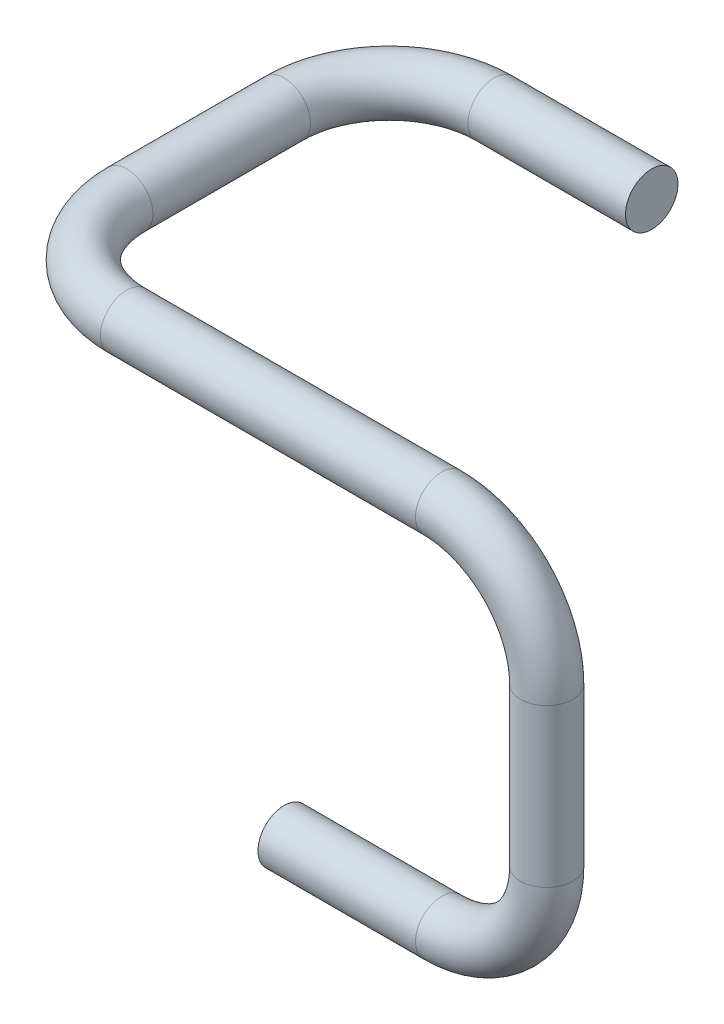
ISO-10303-21;
HEADER;
FILE_DESCRIPTION(('STEP AP214'),'2;1');
FILE_NAME('part.step','',(''),(''),'','','');
FILE_SCHEMA(('AUTOMOTIVE_DESIGN { 1 0 10303 214 1 1 1 1 }'));
ENDSEC;
DATA;
#1=APPLICATION_CONTEXT('core data for automotive mechanical design processes');
#2=APPLICATION_PROTOCOL_DEFINITION('international standard','automotive_design',2000,#1);
#3=PRODUCT_CONTEXT('',#1,'mechanical');
#4=PRODUCT('Part','Part','',(#3));
#5=PRODUCT_RELATED_PRODUCT_CATEGORY('part','',(#4));
#6=PRODUCT_DEFINITION_FORMATION('','',#4);
#7=PRODUCT_DEFINITION_CONTEXT('part definition',#1,'design');
#8=PRODUCT_DEFINITION('design','',#6,#7);
#9=PRODUCT_DEFINITION_SHAPE('','',#8);
#10=(LENGTH_UNIT() NAMED_UNIT(*) SI_UNIT(.MILLI.,.METRE.));
#11=(NAMED_UNIT(*) PLANE_ANGLE_UNIT() SI_UNIT($,.RADIAN.));
#12=(NAMED_UNIT(*) SI_UNIT($,.STERADIAN.) SOLID_ANGLE_UNIT());
#13=UNCERTAINTY_MEASURE_WITH_UNIT(LENGTH_MEASURE(1.E-05),#10,'distance_accuracy_value','');
#14=(GEOMETRIC_REPRESENTATION_CONTEXT(3) GLOBAL_UNCERTAINTY_ASSIGNED_CONTEXT((#13)) GLOBAL_UNIT_ASSIGNED_CONTEXT((#10,
#11,#12)) REPRESENTATION_CONTEXT('',''));
#15=CARTESIAN_POINT('',(0.,0.,0.));
#16=DIRECTION('',(0.,0.,1.));
#17=DIRECTION('',(1.,0.,0.));
#18=AXIS2_PLACEMENT_3D('',#15,#16,#17);
#19=CARTESIAN_POINT('',(5.,0.,-3.5));
#20=DIRECTION('',(1.,0.,0.));
#21=DIRECTION('',(0.,0.,1.));
#22=AXIS2_PLACEMENT_3D('',#19,#20,#21);
#23=PLANE('',#22);
#24=CARTESIAN_POINT('',(5.,0.,-3.5));
#25=DIRECTION('',(1.,0.,0.));
#26=DIRECTION('',(0.,0.,1.));
#27=AXIS2_PLACEMENT_3D('',#24,#25,#26);
#28=CIRCLE('',#27,0.5);
#29=CARTESIAN_POINT('',(5.,0.,-3.));
#30=VERTEX_POINT('',#29);
#31=EDGE_CURVE('E98',#30,#30,#28,.T.);
#32=ORIENTED_EDGE('',*,*,#31,.T.);
#33=EDGE_LOOP('',(#32));
#34=FACE_BOUND('',#33,.T.);
#35=ADVANCED_FACE('F55',(#34),#23,.T.);
#36=CARTESIAN_POINT('',(5.,-7.,3.5));
#37=DIRECTION('',(1.,0.,0.));
#38=DIRECTION('',(0.,0.,-1.));
#39=AXIS2_PLACEMENT_3D('',#36,#37,#38);
#40=PLANE('',#39);
#41=CARTESIAN_POINT('',(5.,-7.,3.5));
#42=DIRECTION('',(1.,0.,0.));
#43=DIRECTION('',(0.,0.,-1.));
#44=AXIS2_PLACEMENT_3D('',#41,#42,#43);
#45=CIRCLE('',#44,0.5);
#46=CARTESIAN_POINT('',(5.,-7.,3.));
#47=VERTEX_POINT('',#46);
#48=EDGE_CURVE('E11',#47,#47,#45,.T.);
#49=ORIENTED_EDGE('',*,*,#48,.F.);
#50=EDGE_LOOP('',(#49));
#51=FACE_BOUND('',#50,.T.);
#52=ADVANCED_FACE('F107',(#51),#40,.F.);
#53=CARTESIAN_POINT('',(5.,0.,-3.5));
#54=DIRECTION('',(-1.,0.,0.));
#55=DIRECTION('',(0.,0.,1.));
#56=AXIS2_PLACEMENT_3D('',#53,#54,#55);
#57=CYLINDRICAL_SURFACE('',#56,0.5);
#58=CARTESIAN_POINT('',(2.,0.,-3.5));
#59=DIRECTION('',(1.,0.,0.));
#60=DIRECTION('',(0.,0.,1.));
#61=AXIS2_PLACEMENT_3D('',#58,#59,#60);
#62=CIRCLE('',#61,0.5);
#63=CARTESIAN_POINT('',(2.,0.,-4.));
#64=VERTEX_POINT('',#63);
#65=EDGE_CURVE('E94',#64,#64,#62,.T.);
#66=ORIENTED_EDGE('',*,*,#65,.T.);
#67=EDGE_LOOP('',(#66));
#68=FACE_BOUND('',#67,.T.);
#69=ORIENTED_EDGE('',*,*,#31,.F.);
#70=EDGE_LOOP('',(#69));
#71=FACE_BOUND('',#70,.T.);
#72=ADVANCED_FACE('F104',(#68,#71),#57,.T.);
#73=CARTESIAN_POINT('',(2.,0.,-1.5));
#74=DIRECTION('',(0.,1.,0.));
#75=DIRECTION('',(0.,0.,1.));
#76=AXIS2_PLACEMENT_3D('',#73,#74,#75);
#77=TOROIDAL_SURFACE('',#76,2.,0.5);
#78=CARTESIAN_POINT('',(0.,0.,-1.5));
#79=DIRECTION('',(0.,0.,-1.));
#80=DIRECTION('',(1.,0.,0.));
#81=AXIS2_PLACEMENT_3D('',#78,#79,#80);
#82=CIRCLE('',#81,0.5);
#83=CARTESIAN_POINT('',(-0.5,0.,-1.5));
#84=VERTEX_POINT('',#83);
#85=EDGE_CURVE('E90',#84,#84,#82,.T.);
#86=CARTESIAN_POINT('',(2.,0.,-1.5));
#87=DIRECTION('',(0.,1.,0.));
#88=DIRECTION('',(0.,0.,1.));
#89=AXIS2_PLACEMENT_3D('',#86,#87,#88);
#90=CIRCLE('',#89,2.5);
#91=EDGE_CURVE('',#64,#84,#90,.T.);
#92=ORIENTED_EDGE('',*,*,#65,.F.);
#93=ORIENTED_EDGE('',*,*,#85,.T.);
#94=ORIENTED_EDGE('',*,*,#91,.T.);
#95=ORIENTED_EDGE('',*,*,#91,.F.);
#96=EDGE_LOOP('',(#92,#94,#93,#95));
#97=FACE_BOUND('',#96,.T.);
#98=ADVANCED_FACE('F106',(#97),#77,.T.);
#99=CARTESIAN_POINT('',(0.,0.,-1.5));
#100=DIRECTION('',(0.,0.,1.));
#101=DIRECTION('',(0.,-1.,0.));
#102=AXIS2_PLACEMENT_3D('',#99,#100,#101);
#103=CYLINDRICAL_SURFACE('',#102,0.5);
#104=CARTESIAN_POINT('',(0.,0.,1.5));
#105=DIRECTION('',(0.,0.,-1.));
#106=DIRECTION('',(1.,0.,0.));
#107=AXIS2_PLACEMENT_3D('',#104,#105,#106);
#108=CIRCLE('',#107,0.5);
#109=CARTESIAN_POINT('',(-0.500000000000001,0.,1.5));
#110=VERTEX_POINT('',#109);
#111=EDGE_CURVE('E86',#110,#110,#108,.T.);
#112=ORIENTED_EDGE('',*,*,#111,.T.);
#113=EDGE_LOOP('',(#112));
#114=FACE_BOUND('',#113,.T.);
#115=ORIENTED_EDGE('',*,*,#85,.F.);
#116=EDGE_LOOP('',(#115));
#117=FACE_BOUND('',#116,.T.);
#118=ADVANCED_FACE('F114',(#114,#117),#103,.T.);
#119=CARTESIAN_POINT('',(2.,0.,1.5));
#120=DIRECTION('',(0.,1.,0.));
#121=DIRECTION('',(0.,0.,1.));
#122=AXIS2_PLACEMENT_3D('',#119,#120,#121);
#123=TOROIDAL_SURFACE('',#122,2.,0.5);
#124=CARTESIAN_POINT('',(2.,0.,3.5));
#125=DIRECTION('',(-1.,0.,0.));
#126=DIRECTION('',(0.,0.,-1.));
#127=AXIS2_PLACEMENT_3D('',#124,#125,#126);
#128=CIRCLE('',#127,0.5);
#129=CARTESIAN_POINT('',(2.,0.,4.));
#130=VERTEX_POINT('',#129);
#131=EDGE_CURVE('E82',#130,#130,#128,.T.);
#132=CARTESIAN_POINT('',(2.,0.,1.5));
#133=DIRECTION('',(0.,1.,0.));
#134=DIRECTION('',(0.,0.,1.));
#135=AXIS2_PLACEMENT_3D('',#132,#133,#134);
#136=CIRCLE('',#135,2.5);
#137=EDGE_CURVE('',#110,#130,#136,.T.);
#138=ORIENTED_EDGE('',*,*,#111,.F.);
#139=ORIENTED_EDGE('',*,*,#131,.T.);
#140=ORIENTED_EDGE('',*,*,#137,.T.);
#141=ORIENTED_EDGE('',*,*,#137,.F.);
#142=EDGE_LOOP('',(#138,#140,#139,#141));
#143=FACE_BOUND('',#142,.T.);
#144=ADVANCED_FACE('F139',(#143),#123,.T.);
#145=CARTESIAN_POINT('',(2.,0.,3.5));
#146=DIRECTION('',(1.,0.,0.));
#147=DIRECTION('',(0.,1.,0.));
#148=AXIS2_PLACEMENT_3D('',#145,#146,#147);
#149=CYLINDRICAL_SURFACE('',#148,0.5);
#150=CARTESIAN_POINT('',(8.,0.,3.5));
#151=DIRECTION('',(-1.,0.,0.));
#152=DIRECTION('',(0.,0.,-1.));
#153=AXIS2_PLACEMENT_3D('',#150,#151,#152);
#154=CIRCLE('',#153,0.5);
#155=CARTESIAN_POINT('',(8.,0.500000000000001,3.5));
#156=VERTEX_POINT('',#155);
#157=EDGE_CURVE('E78',#156,#156,#154,.T.);
#158=ORIENTED_EDGE('',*,*,#157,.T.);
#159=EDGE_LOOP('',(#158));
#160=FACE_BOUND('',#159,.T.);
#161=ORIENTED_EDGE('',*,*,#131,.F.);
#162=EDGE_LOOP('',(#161));
#163=FACE_BOUND('',#162,.T.);
#164=ADVANCED_FACE('F135',(#160,#163),#149,.T.);
#165=CARTESIAN_POINT('',(8.,-2.,3.5));
#166=DIRECTION('',(0.,0.,-1.));
#167=DIRECTION('',(-1.,0.,0.));
#168=AXIS2_PLACEMENT_3D('',#165,#166,#167);
#169=TOROIDAL_SURFACE('',#168,2.,0.5);
#170=CARTESIAN_POINT('',(10.,-2.,3.5));
#171=DIRECTION('',(0.,1.,0.));
#172=DIRECTION('',(0.,0.,-1.));
#173=AXIS2_PLACEMENT_3D('',#170,#171,#172);
#174=CIRCLE('',#173,0.5);
#175=CARTESIAN_POINT('',(10.5,-2.,3.5));
#176=VERTEX_POINT('',#175);
#177=EDGE_CURVE('E72',#176,#176,#174,.T.);
#178=CARTESIAN_POINT('',(8.,-2.,3.5));
#179=DIRECTION('',(0.,0.,-1.));
#180=DIRECTION('',(-1.,0.,0.));
#181=AXIS2_PLACEMENT_3D('',#178,#179,#180);
#182=CIRCLE('',#181,2.5);
#183=EDGE_CURVE('',#156,#176,#182,.T.);
#184=ORIENTED_EDGE('',*,*,#157,.F.);
#185=ORIENTED_EDGE('',*,*,#177,.T.);
#186=ORIENTED_EDGE('',*,*,#183,.T.);
#187=ORIENTED_EDGE('',*,*,#183,.F.);
#188=EDGE_LOOP('',(#184,#186,#185,#187));
#189=FACE_BOUND('',#188,.T.);
#190=ADVANCED_FACE('F131',(#189),#169,.T.);
#191=CARTESIAN_POINT('',(10.,-2.,3.5));
#192=DIRECTION('',(0.,-1.,0.));
#193=DIRECTION('',(0.,0.,-1.));
#194=AXIS2_PLACEMENT_3D('',#191,#192,#193);
#195=CYLINDRICAL_SURFACE('',#194,0.5);
#196=CARTESIAN_POINT('',(10.,-5.,3.5));
#197=DIRECTION('',(0.,1.,0.));
#198=DIRECTION('',(0.,0.,-1.));
#199=AXIS2_PLACEMENT_3D('',#196,#197,#198);
#200=CIRCLE('',#199,0.5);
#201=CARTESIAN_POINT('',(10.5,-5.,3.5));
#202=VERTEX_POINT('',#201);
#203=EDGE_CURVE('E67',#202,#202,#200,.T.);
#204=ORIENTED_EDGE('',*,*,#203,.T.);
#205=EDGE_LOOP('',(#204));
#206=FACE_BOUND('',#205,.T.);
#207=ORIENTED_EDGE('',*,*,#177,.F.);
#208=EDGE_LOOP('',(#207));
#209=FACE_BOUND('',#208,.T.);
#210=ADVANCED_FACE('F125',(#206,#209),#195,.T.);
#211=CARTESIAN_POINT('',(8.,-5.,3.5));
#212=DIRECTION('',(0.,0.,-1.));
#213=DIRECTION('',(-1.,0.,0.));
#214=AXIS2_PLACEMENT_3D('',#211,#212,#213);
#215=TOROIDAL_SURFACE('',#214,2.,0.5);
#216=CARTESIAN_POINT('',(8.,-7.,3.5));
#217=DIRECTION('',(1.,0.,0.));
#218=DIRECTION('',(0.,0.,-1.));
#219=AXIS2_PLACEMENT_3D('',#216,#217,#218);
#220=CIRCLE('',#219,0.5);
#221=CARTESIAN_POINT('',(8.,-7.5,3.5));
#222=VERTEX_POINT('',#221);
#223=EDGE_CURVE('E62',#222,#222,#220,.T.);
#224=CARTESIAN_POINT('',(8.,-5.,3.5));
#225=DIRECTION('',(0.,0.,-1.));
#226=DIRECTION('',(-1.,0.,0.));
#227=AXIS2_PLACEMENT_3D('',#224,#225,#226);
#228=CIRCLE('',#227,2.5);
#229=EDGE_CURVE('',#202,#222,#228,.T.);
#230=ORIENTED_EDGE('',*,*,#203,.F.);
#231=ORIENTED_EDGE('',*,*,#223,.T.);
#232=ORIENTED_EDGE('',*,*,#229,.T.);
#233=ORIENTED_EDGE('',*,*,#229,.F.);
#234=EDGE_LOOP('',(#230,#232,#231,#233));
#235=FACE_BOUND('',#234,.T.);
#236=ADVANCED_FACE('F120',(#235),#215,.T.);
#237=CARTESIAN_POINT('',(8.,-7.,3.5));
#238=DIRECTION('',(-1.,0.,0.));
#239=DIRECTION('',(0.,0.,1.));
#240=AXIS2_PLACEMENT_3D('',#237,#238,#239);
#241=CYLINDRICAL_SURFACE('',#240,0.5);
#242=ORIENTED_EDGE('',*,*,#48,.T.);
#243=EDGE_LOOP('',(#242));
#244=FACE_BOUND('',#243,.T.);
#245=ORIENTED_EDGE('',*,*,#223,.F.);
#246=EDGE_LOOP('',(#245));
#247=FACE_BOUND('',#246,.T.);
#248=ADVANCED_FACE('F118',(#244,#247),#241,.T.);
#249=CLOSED_SHELL('',(#35,#52,#72,#98,#118,#144,#164,#190,#210,#236,#248));
#250=MANIFOLD_SOLID_BREP('B2',#249);
#251=ADVANCED_BREP_SHAPE_REPRESENTATION('',(#18,#250),#14);
#252=SHAPE_DEFINITION_REPRESENTATION(#9,#251);
ENDSEC;
END-ISO-10303-21;
